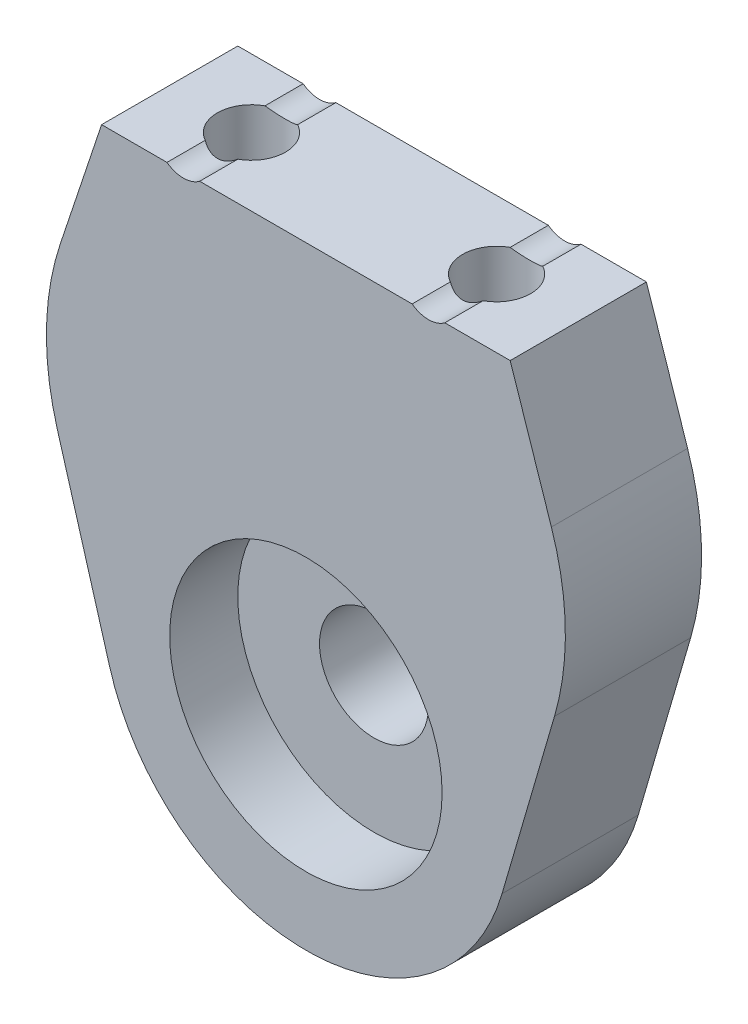
ISO-10303-21;
HEADER;
FILE_DESCRIPTION(('STEP AP214'),'2;1');
FILE_NAME('part.step','',(''),(''),'','','');
FILE_SCHEMA(('AUTOMOTIVE_DESIGN { 1 0 10303 214 1 1 1 1 }'));
ENDSEC;
DATA;
#1=APPLICATION_CONTEXT('core data for automotive mechanical design processes');
#2=APPLICATION_PROTOCOL_DEFINITION('international standard','automotive_design',2000,#1);
#3=PRODUCT_CONTEXT('',#1,'mechanical');
#4=PRODUCT('Part','Part','',(#3));
#5=PRODUCT_RELATED_PRODUCT_CATEGORY('part','',(#4));
#6=PRODUCT_DEFINITION_FORMATION('','',#4);
#7=PRODUCT_DEFINITION_CONTEXT('part definition',#1,'design');
#8=PRODUCT_DEFINITION('design','',#6,#7);
#9=PRODUCT_DEFINITION_SHAPE('','',#8);
#10=(LENGTH_UNIT() NAMED_UNIT(*) SI_UNIT(.MILLI.,.METRE.));
#11=(NAMED_UNIT(*) PLANE_ANGLE_UNIT() SI_UNIT($,.RADIAN.));
#12=(NAMED_UNIT(*) SI_UNIT($,.STERADIAN.) SOLID_ANGLE_UNIT());
#13=UNCERTAINTY_MEASURE_WITH_UNIT(LENGTH_MEASURE(1.E-05),#10,'distance_accuracy_value','');
#14=(GEOMETRIC_REPRESENTATION_CONTEXT(3) GLOBAL_UNCERTAINTY_ASSIGNED_CONTEXT((#13)) GLOBAL_UNIT_ASSIGNED_CONTEXT((#10,
#11,#12)) REPRESENTATION_CONTEXT('',''));
#15=CARTESIAN_POINT('',(0.,0.,0.));
#16=DIRECTION('',(0.,0.,1.));
#17=DIRECTION('',(1.,0.,0.));
#18=AXIS2_PLACEMENT_3D('',#15,#16,#17);
#19=CARTESIAN_POINT('',(-7.5,15.,-21.2132034355964));
#20=DIRECTION('',(0.,1.,0.));
#21=DIRECTION('',(0.,0.,1.));
#22=AXIS2_PLACEMENT_3D('',#19,#20,#21);
#23=PLANE('',#22);
#24=CARTESIAN_POINT('',(4.5,15.,2.5));
#25=DIRECTION('',(0.,1.,0.));
#26=DIRECTION('',(0.,0.,1.));
#27=AXIS2_PLACEMENT_3D('',#24,#25,#26);
#28=CIRCLE('',#27,1.24999999999999);
#29=CARTESIAN_POINT('',(5.1,15.,3.59658560997305));
#30=VERTEX_POINT('',#29);
#31=CARTESIAN_POINT('',(5.1,15.,1.40341439002695));
#32=VERTEX_POINT('',#31);
#33=EDGE_CURVE('E74',#30,#32,#28,.T.);
#34=ORIENTED_EDGE('',*,*,#33,.F.);
#35=DIRECTION('',(0.,0.,-1.));
#36=VECTOR('',#35,1.);
#37=CARTESIAN_POINT('',(5.1,15.,5.));
#38=LINE('',#37,#36);
#39=CARTESIAN_POINT('',(5.1,15.,5.));
#40=VERTEX_POINT('',#39);
#41=EDGE_CURVE('E286',#40,#30,#38,.T.);
#42=ORIENTED_EDGE('',*,*,#41,.F.);
#43=DIRECTION('',(-1.,0.,0.));
#44=VECTOR('',#43,1.);
#45=CARTESIAN_POINT('',(-7.5,15.,5.));
#46=LINE('',#45,#44);
#47=CARTESIAN_POINT('',(7.5,15.,5.));
#48=VERTEX_POINT('',#47);
#49=EDGE_CURVE('E315',#48,#40,#46,.T.);
#50=ORIENTED_EDGE('',*,*,#49,.F.);
#51=DIRECTION('',(0.,0.,1.));
#52=VECTOR('',#51,1.);
#53=CARTESIAN_POINT('',(7.5,15.,-21.2132034355964));
#54=LINE('',#53,#52);
#55=CARTESIAN_POINT('',(7.5,15.,0.));
#56=VERTEX_POINT('',#55);
#57=EDGE_CURVE('E318',#56,#48,#54,.T.);
#58=ORIENTED_EDGE('',*,*,#57,.F.);
#59=DIRECTION('',(1.,0.,0.));
#60=VECTOR('',#59,1.);
#61=CARTESIAN_POINT('',(-7.5,15.,0.));
#62=LINE('',#61,#60);
#63=CARTESIAN_POINT('',(5.1,15.,0.));
#64=VERTEX_POINT('',#63);
#65=EDGE_CURVE('E307',#64,#56,#62,.T.);
#66=ORIENTED_EDGE('',*,*,#65,.F.);
#67=EDGE_CURVE('E282',#32,#64,#38,.T.);
#68=ORIENTED_EDGE('',*,*,#67,.F.);
#69=EDGE_LOOP('',(#34,#42,#50,#58,#66,#68));
#70=FACE_BOUND('',#69,.T.);
#71=ADVANCED_FACE('F46',(#70),#23,.T.);
#72=CARTESIAN_POINT('',(-4.5,15.,2.5));
#73=DIRECTION('',(0.,1.,0.));
#74=DIRECTION('',(0.,0.,1.));
#75=AXIS2_PLACEMENT_3D('',#72,#73,#74);
#76=CIRCLE('',#75,1.24999999999999);
#77=CARTESIAN_POINT('',(-3.9,15.,3.59658560997305));
#78=VERTEX_POINT('',#77);
#79=CARTESIAN_POINT('',(-3.9,15.,1.40341439002695));
#80=VERTEX_POINT('',#79);
#81=EDGE_CURVE('E178',#78,#80,#76,.T.);
#82=ORIENTED_EDGE('',*,*,#81,.F.);
#83=DIRECTION('',(0.,0.,-1.));
#84=VECTOR('',#83,1.);
#85=CARTESIAN_POINT('',(-3.9,15.,5.));
#86=LINE('',#85,#84);
#87=CARTESIAN_POINT('',(-3.9,15.,5.));
#88=VERTEX_POINT('',#87);
#89=EDGE_CURVE('E276',#88,#78,#86,.T.);
#90=ORIENTED_EDGE('',*,*,#89,.F.);
#91=CARTESIAN_POINT('',(3.89999999999999,15.,5.));
#92=VERTEX_POINT('',#91);
#93=EDGE_CURVE('E319',#92,#88,#46,.T.);
#94=ORIENTED_EDGE('',*,*,#93,.F.);
#95=DIRECTION('',(0.,0.,-1.));
#96=VECTOR('',#95,1.);
#97=CARTESIAN_POINT('',(3.89999999999999,15.,5.));
#98=LINE('',#97,#96);
#99=CARTESIAN_POINT('',(3.89999999999999,15.,3.59658560997305));
#100=VERTEX_POINT('',#99);
#101=EDGE_CURVE('E291',#100,#92,#98,.F.);
#102=ORIENTED_EDGE('',*,*,#101,.F.);
#103=CARTESIAN_POINT('',(3.89999999999999,15.,1.40341439002695));
#104=VERTEX_POINT('',#103);
#105=EDGE_CURVE('E181',#104,#100,#28,.T.);
#106=ORIENTED_EDGE('',*,*,#105,.F.);
#107=CARTESIAN_POINT('',(3.89999999999999,15.,0.));
#108=VERTEX_POINT('',#107);
#109=EDGE_CURVE('E285',#108,#104,#98,.F.);
#110=ORIENTED_EDGE('',*,*,#109,.F.);
#111=CARTESIAN_POINT('',(-3.9,15.,0.));
#112=VERTEX_POINT('',#111);
#113=EDGE_CURVE('E304',#112,#108,#62,.T.);
#114=ORIENTED_EDGE('',*,*,#113,.F.);
#115=EDGE_CURVE('E275',#80,#112,#86,.T.);
#116=ORIENTED_EDGE('',*,*,#115,.F.);
#117=EDGE_LOOP('',(#82,#90,#94,#102,#106,#110,#114,#116));
#118=FACE_BOUND('',#117,.T.);
#119=ADVANCED_FACE('F239',(#118),#23,.T.);
#120=CARTESIAN_POINT('',(0.,0.,5.));
#121=DIRECTION('',(0.,0.,-1.));
#122=DIRECTION('',(-1.,0.,0.));
#123=AXIS2_PLACEMENT_3D('',#120,#121,#122);
#124=CYLINDRICAL_SURFACE('',#123,2.);
#125=CARTESIAN_POINT('',(0.,0.,0.));
#126=DIRECTION('',(0.,0.,1.));
#127=DIRECTION('',(1.,0.,0.));
#128=AXIS2_PLACEMENT_3D('',#125,#126,#127);
#129=CIRCLE('',#128,2.);
#130=CARTESIAN_POINT('',(2.,0.,0.));
#131=VERTEX_POINT('',#130);
#132=EDGE_CURVE('E309',#131,#131,#129,.T.);
#133=ORIENTED_EDGE('',*,*,#132,.F.);
#134=EDGE_LOOP('',(#133));
#135=FACE_BOUND('',#134,.T.);
#136=CARTESIAN_POINT('',(0.,0.,2.5));
#137=DIRECTION('',(0.,0.,1.));
#138=DIRECTION('',(1.,0.,0.));
#139=AXIS2_PLACEMENT_3D('',#136,#137,#138);
#140=CIRCLE('',#139,2.);
#141=CARTESIAN_POINT('',(2.,0.,2.5));
#142=VERTEX_POINT('',#141);
#143=EDGE_CURVE('E350',#142,#142,#140,.T.);
#144=ORIENTED_EDGE('',*,*,#143,.T.);
#145=EDGE_LOOP('',(#144));
#146=FACE_BOUND('',#145,.T.);
#147=ADVANCED_FACE('F246',(#135,#146),#124,.F.);
#148=CARTESIAN_POINT('',(0.,0.,5.));
#149=DIRECTION('',(0.,0.,-1.));
#150=DIRECTION('',(-1.,0.,0.));
#151=AXIS2_PLACEMENT_3D('',#148,#149,#150);
#152=CYLINDRICAL_SURFACE('',#151,7.5);
#153=DIRECTION('',(0.,0.,1.));
#154=VECTOR('',#153,1.);
#155=CARTESIAN_POINT('',(7.2,-2.1,-17.3277234511635));
#156=LINE('',#155,#154);
#157=CARTESIAN_POINT('',(7.2,-2.1,0.));
#158=VERTEX_POINT('',#157);
#159=CARTESIAN_POINT('',(7.2,-2.1,5.));
#160=VERTEX_POINT('',#159);
#161=EDGE_CURVE('E368',#158,#160,#156,.T.);
#162=ORIENTED_EDGE('',*,*,#161,.T.);
#163=CARTESIAN_POINT('',(0.,0.,5.));
#164=DIRECTION('',(0.,0.,1.));
#165=DIRECTION('',(1.,0.,0.));
#166=AXIS2_PLACEMENT_3D('',#163,#164,#165);
#167=CIRCLE('',#166,7.5);
#168=CARTESIAN_POINT('',(-7.2,-2.1,5.));
#169=VERTEX_POINT('',#168);
#170=EDGE_CURVE('E328',#169,#160,#167,.T.);
#171=ORIENTED_EDGE('',*,*,#170,.F.);
#172=DIRECTION('',(0.,0.,1.));
#173=VECTOR('',#172,1.);
#174=CARTESIAN_POINT('',(-7.2,-2.1,-17.3277234511635));
#175=LINE('',#174,#173);
#176=CARTESIAN_POINT('',(-7.2,-2.1,0.));
#177=VERTEX_POINT('',#176);
#178=EDGE_CURVE('E313',#177,#169,#175,.T.);
#179=ORIENTED_EDGE('',*,*,#178,.F.);
#180=CARTESIAN_POINT('',(0.,0.,0.));
#181=DIRECTION('',(0.,0.,1.));
#182=DIRECTION('',(1.,0.,0.));
#183=AXIS2_PLACEMENT_3D('',#180,#181,#182);
#184=CIRCLE('',#183,7.5);
#185=EDGE_CURVE('E327',#177,#158,#184,.T.);
#186=ORIENTED_EDGE('',*,*,#185,.T.);
#187=EDGE_LOOP('',(#162,#171,#179,#186));
#188=FACE_BOUND('',#187,.T.);
#189=ADVANCED_FACE('F392',(#188),#152,.T.);
#190=CARTESIAN_POINT('',(0.,0.,5.));
#191=DIRECTION('',(0.,0.,1.));
#192=DIRECTION('',(1.,0.,0.));
#193=AXIS2_PLACEMENT_3D('',#190,#191,#192);
#194=PLANE('',#193);
#195=CARTESIAN_POINT('',(4.5,15.8,5.));
#196=DIRECTION('',(0.,0.,-1.));
#197=DIRECTION('',(-1.,0.,0.));
#198=AXIS2_PLACEMENT_3D('',#195,#196,#197);
#199=CIRCLE('',#198,1.);
#200=EDGE_CURVE('E221',#40,#92,#199,.T.);
#201=ORIENTED_EDGE('',*,*,#200,.T.);
#202=ORIENTED_EDGE('',*,*,#93,.T.);
#203=CARTESIAN_POINT('',(-4.5,15.8,5.));
#204=DIRECTION('',(0.,0.,-1.));
#205=DIRECTION('',(1.,0.,0.));
#206=AXIS2_PLACEMENT_3D('',#203,#204,#205);
#207=CIRCLE('',#206,1.);
#208=CARTESIAN_POINT('',(-5.10000000000001,15.,5.));
#209=VERTEX_POINT('',#208);
#210=EDGE_CURVE('E219',#88,#209,#207,.T.);
#211=ORIENTED_EDGE('',*,*,#210,.T.);
#212=CARTESIAN_POINT('',(-7.5,15.,5.));
#213=VERTEX_POINT('',#212);
#214=EDGE_CURVE('E320',#209,#213,#46,.T.);
#215=ORIENTED_EDGE('',*,*,#214,.T.);
#216=DIRECTION('',(-0.316227766016838,-0.948683298050514,0.));
#217=VECTOR('',#216,1.);
#218=CARTESIAN_POINT('',(-7.5,15.,5.));
#219=LINE('',#218,#217);
#220=CARTESIAN_POINT('',(-9.01217884246544,10.4634634726037,5.));
#221=VERTEX_POINT('',#220);
#222=EDGE_CURVE('E381',#213,#221,#219,.T.);
#223=ORIENTED_EDGE('',*,*,#222,.T.);
#224=CARTESIAN_POINT('',(0.474654138039701,7.30118581243531,5.));
#225=DIRECTION('',(0.,0.,1.));
#226=DIRECTION('',(1.,0.,0.));
#227=AXIS2_PLACEMENT_3D('',#224,#225,#226);
#228=CIRCLE('',#227,10.);
#229=CARTESIAN_POINT('',(-9.1253458619603,4.50118581243531,5.));
#230=VERTEX_POINT('',#229);
#231=EDGE_CURVE('E336',#221,#230,#228,.T.);
#232=ORIENTED_EDGE('',*,*,#231,.T.);
#233=DIRECTION('',(0.28,-0.96,0.));
#234=VECTOR('',#233,1.);
#235=CARTESIAN_POINT('',(-10.,7.5,5.));
#236=LINE('',#235,#234);
#237=EDGE_CURVE('E370',#230,#169,#236,.T.);
#238=ORIENTED_EDGE('',*,*,#237,.T.);
#239=ORIENTED_EDGE('',*,*,#170,.T.);
#240=DIRECTION('',(0.28,0.96,0.));
#241=VECTOR('',#240,1.);
#242=CARTESIAN_POINT('',(10.,7.5,5.));
#243=LINE('',#242,#241);
#244=CARTESIAN_POINT('',(9.1253458619603,4.50118581243531,5.));
#245=VERTEX_POINT('',#244);
#246=EDGE_CURVE('E356',#160,#245,#243,.T.);
#247=ORIENTED_EDGE('',*,*,#246,.T.);
#248=CARTESIAN_POINT('',(-0.4746541380397,7.30118581243531,5.));
#249=DIRECTION('',(0.,0.,1.));
#250=DIRECTION('',(1.,0.,0.));
#251=AXIS2_PLACEMENT_3D('',#248,#249,#250);
#252=CIRCLE('',#251,10.);
#253=CARTESIAN_POINT('',(9.01217884246543,10.4634634726037,5.));
#254=VERTEX_POINT('',#253);
#255=EDGE_CURVE('E338',#245,#254,#252,.T.);
#256=ORIENTED_EDGE('',*,*,#255,.T.);
#257=DIRECTION('',(-0.316227766016838,0.948683298050514,0.));
#258=VECTOR('',#257,1.);
#259=CARTESIAN_POINT('',(7.5,15.,5.));
#260=LINE('',#259,#258);
#261=EDGE_CURVE('E352',#254,#48,#260,.T.);
#262=ORIENTED_EDGE('',*,*,#261,.T.);
#263=ORIENTED_EDGE('',*,*,#49,.T.);
#264=EDGE_LOOP('',(#201,#202,#211,#215,#223,#232,#238,#239,#247,#256,#262,#263));
#265=FACE_BOUND('',#264,.T.);
#266=CARTESIAN_POINT('',(0.,0.,5.));
#267=DIRECTION('',(0.,0.,1.));
#268=DIRECTION('',(1.,0.,0.));
#269=AXIS2_PLACEMENT_3D('',#266,#267,#268);
#270=CIRCLE('',#269,5.);
#271=CARTESIAN_POINT('',(5.,0.,5.));
#272=VERTEX_POINT('',#271);
#273=EDGE_CURVE('E278',#272,#272,#270,.T.);
#274=ORIENTED_EDGE('',*,*,#273,.F.);
#275=EDGE_LOOP('',(#274));
#276=FACE_BOUND('',#275,.T.);
#277=ADVANCED_FACE('F260',(#265,#276),#194,.T.);
#278=CARTESIAN_POINT('',(0.,0.,0.));
#279=DIRECTION('',(0.,0.,1.));
#280=DIRECTION('',(1.,0.,0.));
#281=AXIS2_PLACEMENT_3D('',#278,#279,#280);
#282=PLANE('',#281);
#283=ORIENTED_EDGE('',*,*,#113,.T.);
#284=CARTESIAN_POINT('',(4.5,15.8,0.));
#285=DIRECTION('',(0.,0.,-1.));
#286=DIRECTION('',(-1.,0.,0.));
#287=AXIS2_PLACEMENT_3D('',#284,#285,#286);
#288=CIRCLE('',#287,1.);
#289=EDGE_CURVE('E295',#64,#108,#288,.T.);
#290=ORIENTED_EDGE('',*,*,#289,.F.);
#291=ORIENTED_EDGE('',*,*,#65,.T.);
#292=DIRECTION('',(0.316227766016838,-0.948683298050514,0.));
#293=VECTOR('',#292,1.);
#294=CARTESIAN_POINT('',(7.5,15.,0.));
#295=LINE('',#294,#293);
#296=CARTESIAN_POINT('',(9.01217884246544,10.4634634726037,0.));
#297=VERTEX_POINT('',#296);
#298=EDGE_CURVE('E367',#56,#297,#295,.T.);
#299=ORIENTED_EDGE('',*,*,#298,.T.);
#300=CARTESIAN_POINT('',(-0.4746541380397,7.30118581243531,0.));
#301=DIRECTION('',(0.,0.,1.));
#302=DIRECTION('',(1.,0.,0.));
#303=AXIS2_PLACEMENT_3D('',#300,#301,#302);
#304=CIRCLE('',#303,10.);
#305=CARTESIAN_POINT('',(9.1253458619603,4.50118581243531,0.));
#306=VERTEX_POINT('',#305);
#307=EDGE_CURVE('E344',#297,#306,#304,.F.);
#308=ORIENTED_EDGE('',*,*,#307,.T.);
#309=DIRECTION('',(-0.28,-0.96,0.));
#310=VECTOR('',#309,1.);
#311=CARTESIAN_POINT('',(10.,7.5,0.));
#312=LINE('',#311,#310);
#313=EDGE_CURVE('E365',#306,#158,#312,.T.);
#314=ORIENTED_EDGE('',*,*,#313,.T.);
#315=ORIENTED_EDGE('',*,*,#185,.F.);
#316=DIRECTION('',(-0.28,0.96,0.));
#317=VECTOR('',#316,1.);
#318=CARTESIAN_POINT('',(-10.,7.5,0.));
#319=LINE('',#318,#317);
#320=CARTESIAN_POINT('',(-9.1253458619603,4.50118581243531,0.));
#321=VERTEX_POINT('',#320);
#322=EDGE_CURVE('E378',#177,#321,#319,.T.);
#323=ORIENTED_EDGE('',*,*,#322,.T.);
#324=CARTESIAN_POINT('',(0.474654138039701,7.30118581243531,0.));
#325=DIRECTION('',(0.,0.,1.));
#326=DIRECTION('',(1.,0.,0.));
#327=AXIS2_PLACEMENT_3D('',#324,#325,#326);
#328=CIRCLE('',#327,10.);
#329=CARTESIAN_POINT('',(-9.01217884246544,10.4634634726037,0.));
#330=VERTEX_POINT('',#329);
#331=EDGE_CURVE('E342',#321,#330,#328,.F.);
#332=ORIENTED_EDGE('',*,*,#331,.T.);
#333=DIRECTION('',(0.316227766016838,0.948683298050514,0.));
#334=VECTOR('',#333,1.);
#335=CARTESIAN_POINT('',(-7.5,15.,0.));
#336=LINE('',#335,#334);
#337=CARTESIAN_POINT('',(-7.5,15.,0.));
#338=VERTEX_POINT('',#337);
#339=EDGE_CURVE('E376',#330,#338,#336,.T.);
#340=ORIENTED_EDGE('',*,*,#339,.T.);
#341=CARTESIAN_POINT('',(-5.10000000000001,15.,0.));
#342=VERTEX_POINT('',#341);
#343=EDGE_CURVE('E306',#338,#342,#62,.T.);
#344=ORIENTED_EDGE('',*,*,#343,.T.);
#345=CARTESIAN_POINT('',(-4.5,15.8,0.));
#346=DIRECTION('',(0.,0.,-1.));
#347=DIRECTION('',(1.,0.,0.));
#348=AXIS2_PLACEMENT_3D('',#345,#346,#347);
#349=CIRCLE('',#348,1.);
#350=EDGE_CURVE('E274',#112,#342,#349,.T.);
#351=ORIENTED_EDGE('',*,*,#350,.F.);
#352=EDGE_LOOP('',(#283,#290,#291,#299,#308,#314,#315,#323,#332,#340,#344,#351));
#353=FACE_BOUND('',#352,.T.);
#354=ORIENTED_EDGE('',*,*,#132,.T.);
#355=EDGE_LOOP('',(#354));
#356=FACE_BOUND('',#355,.T.);
#357=ADVANCED_FACE('F252',(#353,#356),#282,.F.);
#358=CARTESIAN_POINT('',(-5.10000000000001,15.,1.40341439002695));
#359=VERTEX_POINT('',#358);
#360=CARTESIAN_POINT('',(-5.10000000000001,15.,3.59658560997305));
#361=VERTEX_POINT('',#360);
#362=EDGE_CURVE('E67',#359,#361,#76,.T.);
#363=ORIENTED_EDGE('',*,*,#362,.F.);
#364=DIRECTION('',(0.,0.,-1.));
#365=VECTOR('',#364,1.);
#366=CARTESIAN_POINT('',(-5.10000000000001,15.,5.));
#367=LINE('',#366,#365);
#368=EDGE_CURVE('E267',#342,#359,#367,.F.);
#369=ORIENTED_EDGE('',*,*,#368,.F.);
#370=ORIENTED_EDGE('',*,*,#343,.F.);
#371=DIRECTION('',(0.,0.,1.));
#372=VECTOR('',#371,1.);
#373=CARTESIAN_POINT('',(-7.5,15.,-21.2132034355964));
#374=LINE('',#373,#372);
#375=EDGE_CURVE('E310',#338,#213,#374,.T.);
#376=ORIENTED_EDGE('',*,*,#375,.T.);
#377=ORIENTED_EDGE('',*,*,#214,.F.);
#378=EDGE_CURVE('E270',#361,#209,#367,.F.);
#379=ORIENTED_EDGE('',*,*,#378,.F.);
#380=EDGE_LOOP('',(#363,#369,#370,#376,#377,#379));
#381=FACE_BOUND('',#380,.T.);
#382=ADVANCED_FACE('F242',(#381),#23,.T.);
#383=CARTESIAN_POINT('',(-10.,7.5,-17.3277234511635));
#384=DIRECTION('',(-0.96,-0.28,0.));
#385=DIRECTION('',(0.28,-0.96,0.));
#386=AXIS2_PLACEMENT_3D('',#383,#384,#385);
#387=PLANE('',#386);
#388=ORIENTED_EDGE('',*,*,#237,.F.);
#389=DIRECTION('',(0.,0.,1.));
#390=VECTOR('',#389,1.);
#391=CARTESIAN_POINT('',(-9.1253458619603,4.50118581243531,-17.3277234511635));
#392=LINE('',#391,#390);
#393=EDGE_CURVE('E349',#230,#321,#392,.F.);
#394=ORIENTED_EDGE('',*,*,#393,.T.);
#395=ORIENTED_EDGE('',*,*,#322,.F.);
#396=ORIENTED_EDGE('',*,*,#178,.T.);
#397=EDGE_LOOP('',(#388,#394,#395,#396));
#398=FACE_BOUND('',#397,.T.);
#399=ADVANCED_FACE('F251',(#398),#387,.T.);
#400=CARTESIAN_POINT('',(-7.5,15.,-17.3277234511635));
#401=DIRECTION('',(-0.948683298050514,0.316227766016838,0.));
#402=DIRECTION('',(-0.316227766016838,-0.948683298050514,0.));
#403=AXIS2_PLACEMENT_3D('',#400,#401,#402);
#404=PLANE('',#403);
#405=ORIENTED_EDGE('',*,*,#339,.F.);
#406=DIRECTION('',(0.,0.,1.));
#407=VECTOR('',#406,1.);
#408=CARTESIAN_POINT('',(-9.01217884246544,10.4634634726037,-17.3277234511635));
#409=LINE('',#408,#407);
#410=EDGE_CURVE('E346',#330,#221,#409,.T.);
#411=ORIENTED_EDGE('',*,*,#410,.T.);
#412=ORIENTED_EDGE('',*,*,#222,.F.);
#413=ORIENTED_EDGE('',*,*,#375,.F.);
#414=EDGE_LOOP('',(#405,#411,#412,#413));
#415=FACE_BOUND('',#414,.T.);
#416=ADVANCED_FACE('F258',(#415),#404,.T.);
#417=CARTESIAN_POINT('',(7.5,15.,-17.3277234511635));
#418=DIRECTION('',(0.948683298050514,0.316227766016838,0.));
#419=DIRECTION('',(-0.316227766016838,0.948683298050514,0.));
#420=AXIS2_PLACEMENT_3D('',#417,#418,#419);
#421=PLANE('',#420);
#422=ORIENTED_EDGE('',*,*,#261,.F.);
#423=DIRECTION('',(0.,0.,1.));
#424=VECTOR('',#423,1.);
#425=CARTESIAN_POINT('',(9.01217884246544,10.4634634726037,-17.3277234511635));
#426=LINE('',#425,#424);
#427=EDGE_CURVE('E340',#254,#297,#426,.F.);
#428=ORIENTED_EDGE('',*,*,#427,.T.);
#429=ORIENTED_EDGE('',*,*,#298,.F.);
#430=ORIENTED_EDGE('',*,*,#57,.T.);
#431=EDGE_LOOP('',(#422,#428,#429,#430));
#432=FACE_BOUND('',#431,.T.);
#433=ADVANCED_FACE('F411',(#432),#421,.T.);
#434=CARTESIAN_POINT('',(10.,7.5,-17.3277234511635));
#435=DIRECTION('',(0.96,-0.28,0.));
#436=DIRECTION('',(0.28,0.96,0.));
#437=AXIS2_PLACEMENT_3D('',#434,#435,#436);
#438=PLANE('',#437);
#439=ORIENTED_EDGE('',*,*,#313,.F.);
#440=DIRECTION('',(0.,0.,1.));
#441=VECTOR('',#440,1.);
#442=CARTESIAN_POINT('',(9.1253458619603,4.50118581243531,-17.3277234511635));
#443=LINE('',#442,#441);
#444=EDGE_CURVE('E331',#306,#245,#443,.T.);
#445=ORIENTED_EDGE('',*,*,#444,.T.);
#446=ORIENTED_EDGE('',*,*,#246,.F.);
#447=ORIENTED_EDGE('',*,*,#161,.F.);
#448=EDGE_LOOP('',(#439,#445,#446,#447));
#449=FACE_BOUND('',#448,.T.);
#450=ADVANCED_FACE('F405',(#449),#438,.T.);
#451=CARTESIAN_POINT('',(-0.4746541380397,7.30118581243531,-17.3277234511635));
#452=DIRECTION('',(0.,0.,1.));
#453=DIRECTION('',(1.,0.,0.));
#454=AXIS2_PLACEMENT_3D('',#451,#452,#453);
#455=CYLINDRICAL_SURFACE('',#454,10.);
#456=ORIENTED_EDGE('',*,*,#307,.F.);
#457=ORIENTED_EDGE('',*,*,#427,.F.);
#458=ORIENTED_EDGE('',*,*,#255,.F.);
#459=ORIENTED_EDGE('',*,*,#444,.F.);
#460=EDGE_LOOP('',(#456,#457,#458,#459));
#461=FACE_BOUND('',#460,.T.);
#462=ADVANCED_FACE('F407',(#461),#455,.T.);
#463=CARTESIAN_POINT('',(0.474654138039701,7.30118581243531,-17.3277234511635));
#464=DIRECTION('',(0.,0.,1.));
#465=DIRECTION('',(1.,0.,0.));
#466=AXIS2_PLACEMENT_3D('',#463,#464,#465);
#467=CYLINDRICAL_SURFACE('',#466,10.);
#468=ORIENTED_EDGE('',*,*,#331,.F.);
#469=ORIENTED_EDGE('',*,*,#393,.F.);
#470=ORIENTED_EDGE('',*,*,#231,.F.);
#471=ORIENTED_EDGE('',*,*,#410,.F.);
#472=EDGE_LOOP('',(#468,#469,#470,#471));
#473=FACE_BOUND('',#472,.T.);
#474=ADVANCED_FACE('F48',(#473),#467,.T.);
#475=CARTESIAN_POINT('',(0.,0.,2.5));
#476=DIRECTION('',(0.,0.,1.));
#477=DIRECTION('',(1.,0.,0.));
#478=AXIS2_PLACEMENT_3D('',#475,#476,#477);
#479=CYLINDRICAL_SURFACE('',#478,5.);
#480=CARTESIAN_POINT('',(0.,0.,2.5));
#481=DIRECTION('',(0.,0.,1.));
#482=DIRECTION('',(1.,0.,0.));
#483=AXIS2_PLACEMENT_3D('',#480,#481,#482);
#484=CIRCLE('',#483,5.);
#485=CARTESIAN_POINT('',(5.,0.,2.5));
#486=VERTEX_POINT('',#485);
#487=EDGE_CURVE('E353',#486,#486,#484,.T.);
#488=ORIENTED_EDGE('',*,*,#487,.F.);
#489=EDGE_LOOP('',(#488));
#490=FACE_BOUND('',#489,.T.);
#491=ORIENTED_EDGE('',*,*,#273,.T.);
#492=EDGE_LOOP('',(#491));
#493=FACE_BOUND('',#492,.T.);
#494=ADVANCED_FACE('F235',(#490,#493),#479,.F.);
#495=CARTESIAN_POINT('',(0.,0.,2.5));
#496=DIRECTION('',(0.,0.,1.));
#497=DIRECTION('',(1.,0.,0.));
#498=AXIS2_PLACEMENT_3D('',#495,#496,#497);
#499=PLANE('',#498);
#500=ORIENTED_EDGE('',*,*,#143,.F.);
#501=EDGE_LOOP('',(#500));
#502=FACE_BOUND('',#501,.T.);
#503=ORIENTED_EDGE('',*,*,#487,.T.);
#504=EDGE_LOOP('',(#503));
#505=FACE_BOUND('',#504,.T.);
#506=ADVANCED_FACE('F227',(#502,#505),#499,.T.);
#507=CARTESIAN_POINT('',(4.5,15.8,5.));
#508=DIRECTION('',(0.,0.,-1.));
#509=DIRECTION('',(-1.,0.,0.));
#510=AXIS2_PLACEMENT_3D('',#507,#508,#509);
#511=CYLINDRICAL_SURFACE('',#510,1.);
#512=ORIENTED_EDGE('',*,*,#41,.T.);
#513=CARTESIAN_POINT('',(5.1,15.,3.59658560997305));
#514=CARTESIAN_POINT('',(5.0621606110136,14.9715939387001,3.61733312031784));
#515=CARTESIAN_POINT('',(5.02172521739274,14.9454955238183,3.63686567463709));
#516=CARTESIAN_POINT('',(4.93599902593592,14.8987242285809,3.67241214424978));
#517=CARTESIAN_POINT('',(4.8906746471093,14.8780927424333,3.68839907249321));
#518=CARTESIAN_POINT('',(4.7958067976335,14.8434123101396,3.71550261304154));
#519=CARTESIAN_POINT('',(4.74624017320997,14.8294026208368,3.72659015507413));
#520=CARTESIAN_POINT('',(4.64473934601039,14.8091858719137,3.74264760506819));
#521=CARTESIAN_POINT('',(4.59281473704862,14.8029496978447,3.7476403386894));
#522=CARTESIAN_POINT('',(4.49439021167574,14.7989437450897,3.75084510322957));
#523=CARTESIAN_POINT('',(4.44794699595056,14.8002895095487,3.7497655154879));
#524=CARTESIAN_POINT('',(4.35605719949201,14.809337247898,3.74253977168698));
#525=CARTESIAN_POINT('',(4.31061139722522,14.8170440171798,3.7363897931997));
#526=CARTESIAN_POINT('',(4.22375050410616,14.8379151219033,3.71986423457122));
#527=CARTESIAN_POINT('',(4.18224751488552,14.8508570176514,3.70966115486539));
#528=CARTESIAN_POINT('',(4.10214164765266,14.8815506473168,3.6857304894337));
#529=CARTESIAN_POINT('',(4.06353963598471,14.8993038108315,3.67200185620518));
#530=CARTESIAN_POINT('',(4.00421842738448,14.9311786217879,3.64773238285719));
#531=CARTESIAN_POINT('',(3.9824209314735,14.943995780743,3.63805153975628));
#532=CARTESIAN_POINT('',(3.94019696215797,14.9709974498632,3.6178845862529));
#533=CARTESIAN_POINT('',(3.91976620945191,14.985177317297,3.60740123320559));
#534=CARTESIAN_POINT('',(3.89999999999999,15.,3.59658560997305));
#535=B_SPLINE_CURVE_WITH_KNOTS('',3,(#513,#514,#515,#516,#517,#518,#519,#520,#521,#522,#523,
#524,#525,#526,#527,#528,#529,#530,#531,#532,#533,#534),.UNSPECIFIED.,.F.,.F.,(4,2,2,2,2,2,2,2,
2,2,4),(0.,0.15508840486581,0.311319555923142,0.468465641907842,0.62502137667001,
0.763722354664079,0.902527991222132,1.03596896841179,1.16944963917844,1.2506056188113,
1.33149429275095),.UNSPECIFIED.);
#536=EDGE_CURVE('E212',#30,#100,#535,.T.);
#537=ORIENTED_EDGE('',*,*,#536,.T.);
#538=ORIENTED_EDGE('',*,*,#101,.T.);
#539=ORIENTED_EDGE('',*,*,#200,.F.);
#540=EDGE_LOOP('',(#512,#537,#538,#539));
#541=FACE_BOUND('',#540,.T.);
#542=ADVANCED_FACE('F223',(#541),#511,.F.);
#543=ORIENTED_EDGE('',*,*,#109,.T.);
#544=CARTESIAN_POINT('',(3.89999999999999,15.,1.40341439002695));
#545=CARTESIAN_POINT('',(3.93783938898639,14.9715939387001,1.38266687968216));
#546=CARTESIAN_POINT('',(3.97827478260725,14.9454955238183,1.36313432536291));
#547=CARTESIAN_POINT('',(4.06400097406407,14.8987242285809,1.32758785575022));
#548=CARTESIAN_POINT('',(4.10932535289069,14.8780927424333,1.31160092750679));
#549=CARTESIAN_POINT('',(4.2041932023665,14.8434123101396,1.28449738695846));
#550=CARTESIAN_POINT('',(4.25375982679003,14.8294026208368,1.27340984492587));
#551=CARTESIAN_POINT('',(4.35526065398961,14.8091858719137,1.25735239493181));
#552=CARTESIAN_POINT('',(4.40718526295137,14.8029496978447,1.2523596613106));
#553=CARTESIAN_POINT('',(4.50560978832425,14.7989437450897,1.24915489677043));
#554=CARTESIAN_POINT('',(4.55205300404944,14.8002895095487,1.2502344845121));
#555=CARTESIAN_POINT('',(4.64394280050798,14.809337247898,1.25746022831302));
#556=CARTESIAN_POINT('',(4.68938860277478,14.8170440171798,1.2636102068003));
#557=CARTESIAN_POINT('',(4.77624949589383,14.8379151219033,1.28013576542878));
#558=CARTESIAN_POINT('',(4.81775248511447,14.8508570176514,1.29033884513461));
#559=CARTESIAN_POINT('',(4.89785835234733,14.8815506473168,1.3142695105663));
#560=CARTESIAN_POINT('',(4.93646036401528,14.8993038108315,1.32799814379482));
#561=CARTESIAN_POINT('',(4.99578157261552,14.9311786217879,1.35226761714281));
#562=CARTESIAN_POINT('',(5.01757906852649,14.943995780743,1.36194846024373));
#563=CARTESIAN_POINT('',(5.05980303784202,14.9709974498632,1.3821154137471));
#564=CARTESIAN_POINT('',(5.08023379054808,14.985177317297,1.39259876679441));
#565=CARTESIAN_POINT('',(5.1,15.,1.40341439002695));
#566=B_SPLINE_CURVE_WITH_KNOTS('',3,(#544,#545,#546,#547,#548,#549,#550,#551,#552,#553,#554,
#555,#556,#557,#558,#559,#560,#561,#562,#563,#564,#565),.UNSPECIFIED.,.F.,.F.,(4,2,2,2,2,2,2,2,
2,2,4),(0.,0.155088404865809,0.311319555923142,0.468465641907843,0.625021376670011,
0.76372235466408,0.902527991222134,1.0359689684118,1.16944963917844,1.2506056188113,
1.33149429275095),.UNSPECIFIED.);
#567=EDGE_CURVE('E60',#104,#32,#566,.T.);
#568=ORIENTED_EDGE('',*,*,#567,.T.);
#569=ORIENTED_EDGE('',*,*,#67,.T.);
#570=ORIENTED_EDGE('',*,*,#289,.T.);
#571=EDGE_LOOP('',(#543,#568,#569,#570));
#572=FACE_BOUND('',#571,.T.);
#573=ADVANCED_FACE('F226',(#572),#511,.F.);
#574=CARTESIAN_POINT('',(-4.5,15.8,5.));
#575=DIRECTION('',(0.,0.,-1.));
#576=DIRECTION('',(-1.,0.,0.));
#577=AXIS2_PLACEMENT_3D('',#574,#575,#576);
#578=CYLINDRICAL_SURFACE('',#577,1.);
#579=ORIENTED_EDGE('',*,*,#89,.T.);
#580=CARTESIAN_POINT('',(-3.9,15.,3.59658560997305));
#581=CARTESIAN_POINT('',(-3.9378393889864,14.9715939387001,3.61733312031784));
#582=CARTESIAN_POINT('',(-3.97827478260726,14.9454955238183,3.6368656746371));
#583=CARTESIAN_POINT('',(-4.06400097406408,14.8987242285809,3.67241214424979));
#584=CARTESIAN_POINT('',(-4.10932535289069,14.8780927424333,3.68839907249321));
#585=CARTESIAN_POINT('',(-4.2041932023665,14.8434123101396,3.71550261304154));
#586=CARTESIAN_POINT('',(-4.25375982679003,14.8294026208368,3.72659015507413));
#587=CARTESIAN_POINT('',(-4.35526065398961,14.8091858719137,3.74264760506819));
#588=CARTESIAN_POINT('',(-4.40718526295138,14.8029496978447,3.7476403386894));
#589=CARTESIAN_POINT('',(-4.50560978832426,14.7989437450897,3.75084510322957));
#590=CARTESIAN_POINT('',(-4.55205300404944,14.8002895095487,3.7497655154879));
#591=CARTESIAN_POINT('',(-4.64394280050799,14.809337247898,3.74253977168698));
#592=CARTESIAN_POINT('',(-4.68938860277478,14.8170440171798,3.7363897931997));
#593=CARTESIAN_POINT('',(-4.77624949589384,14.8379151219033,3.71986423457122));
#594=CARTESIAN_POINT('',(-4.81775248511448,14.8508570176514,3.70966115486539));
#595=CARTESIAN_POINT('',(-4.89785835234734,14.8815506473168,3.6857304894337));
#596=CARTESIAN_POINT('',(-4.93646036401529,14.8993038108315,3.67200185620518));
#597=CARTESIAN_POINT('',(-4.99578157261552,14.9311786217879,3.64773238285719));
#598=CARTESIAN_POINT('',(-5.0175790685265,14.943995780743,3.63805153975627));
#599=CARTESIAN_POINT('',(-5.05980303784203,14.9709974498632,3.61788458625289));
#600=CARTESIAN_POINT('',(-5.08023379054809,14.985177317297,3.60740123320559));
#601=CARTESIAN_POINT('',(-5.10000000000001,15.,3.59658560997305));
#602=B_SPLINE_CURVE_WITH_KNOTS('',3,(#580,#581,#582,#583,#584,#585,#586,#587,#588,#589,#590,
#591,#592,#593,#594,#595,#596,#597,#598,#599,#600,#601),.UNSPECIFIED.,.F.,.F.,(4,2,2,2,2,2,2,2,
2,2,4),(0.,0.15508840486581,0.311319555923142,0.468465641907842,0.625021376670011,
0.763722354664079,0.902527991222132,1.03596896841179,1.16944963917844,1.2506056188113,
1.33149429275095),.UNSPECIFIED.);
#603=EDGE_CURVE('E11',#78,#361,#602,.T.);
#604=ORIENTED_EDGE('',*,*,#603,.T.);
#605=ORIENTED_EDGE('',*,*,#378,.T.);
#606=ORIENTED_EDGE('',*,*,#210,.F.);
#607=EDGE_LOOP('',(#579,#604,#605,#606));
#608=FACE_BOUND('',#607,.T.);
#609=ADVANCED_FACE('F190',(#608),#578,.F.);
#610=ORIENTED_EDGE('',*,*,#368,.T.);
#611=CARTESIAN_POINT('',(-5.10000000000001,15.,1.40341439002695));
#612=CARTESIAN_POINT('',(-5.06216061101361,14.9715939387001,1.38266687968217));
#613=CARTESIAN_POINT('',(-5.02172521739274,14.9454955238183,1.36313432536291));
#614=CARTESIAN_POINT('',(-4.93599902593593,14.8987242285809,1.32758785575022));
#615=CARTESIAN_POINT('',(-4.89067464710931,14.8780927424333,1.31160092750679));
#616=CARTESIAN_POINT('',(-4.7958067976335,14.8434123101396,1.28449738695846));
#617=CARTESIAN_POINT('',(-4.74624017320997,14.8294026208368,1.27340984492587));
#618=CARTESIAN_POINT('',(-4.64473934601039,14.8091858719137,1.25735239493181));
#619=CARTESIAN_POINT('',(-4.59281473704863,14.8029496978447,1.2523596613106));
#620=CARTESIAN_POINT('',(-4.49439021167575,14.7989437450897,1.24915489677043));
#621=CARTESIAN_POINT('',(-4.44794699595056,14.8002895095487,1.2502344845121));
#622=CARTESIAN_POINT('',(-4.35605719949202,14.809337247898,1.25746022831302));
#623=CARTESIAN_POINT('',(-4.31061139722522,14.8170440171798,1.2636102068003));
#624=CARTESIAN_POINT('',(-4.22375050410617,14.8379151219033,1.28013576542878));
#625=CARTESIAN_POINT('',(-4.18224751488553,14.8508570176514,1.29033884513461));
#626=CARTESIAN_POINT('',(-4.10214164765266,14.8815506473168,1.3142695105663));
#627=CARTESIAN_POINT('',(-4.06353963598472,14.8993038108315,1.32799814379482));
#628=CARTESIAN_POINT('',(-4.00421842738448,14.9311786217879,1.35226761714281));
#629=CARTESIAN_POINT('',(-3.98242093147351,14.943995780743,1.36194846024372));
#630=CARTESIAN_POINT('',(-3.94019696215797,14.9709974498632,1.3821154137471));
#631=CARTESIAN_POINT('',(-3.91976620945192,14.985177317297,1.39259876679441));
#632=CARTESIAN_POINT('',(-3.9,15.,1.40341439002695));
#633=B_SPLINE_CURVE_WITH_KNOTS('',3,(#611,#612,#613,#614,#615,#616,#617,#618,#619,#620,#621,
#622,#623,#624,#625,#626,#627,#628,#629,#630,#631,#632),.UNSPECIFIED.,.F.,.F.,(4,2,2,2,2,2,2,2,
2,2,4),(0.,0.155088404865809,0.311319555923142,0.468465641907843,0.625021376670011,
0.763722354664081,0.902527991222134,1.0359689684118,1.16944963917844,1.2506056188113,
1.33149429275095),.UNSPECIFIED.);
#634=EDGE_CURVE('E177',#359,#80,#633,.T.);
#635=ORIENTED_EDGE('',*,*,#634,.T.);
#636=ORIENTED_EDGE('',*,*,#115,.T.);
#637=ORIENTED_EDGE('',*,*,#350,.T.);
#638=EDGE_LOOP('',(#610,#635,#636,#637));
#639=FACE_BOUND('',#638,.T.);
#640=ADVANCED_FACE('F203',(#639),#578,.F.);
#641=CARTESIAN_POINT('',(4.5,15.,2.5));
#642=DIRECTION('',(0.,1.,0.));
#643=DIRECTION('',(0.,0.,1.));
#644=AXIS2_PLACEMENT_3D('',#641,#642,#643);
#645=CYLINDRICAL_SURFACE('',#644,1.24999999999999);
#646=CARTESIAN_POINT('',(4.5,6.49999999999999,2.5));
#647=DIRECTION('',(0.,1.,0.));
#648=DIRECTION('',(0.,0.,1.));
#649=AXIS2_PLACEMENT_3D('',#646,#647,#648);
#650=CIRCLE('',#649,1.24999999999999);
#651=CARTESIAN_POINT('',(4.5,6.49999999999999,3.74999999999999));
#652=VERTEX_POINT('',#651);
#653=EDGE_CURVE('E220',#652,#652,#650,.T.);
#654=ORIENTED_EDGE('',*,*,#653,.F.);
#655=EDGE_LOOP('',(#654));
#656=FACE_BOUND('',#655,.T.);
#657=ORIENTED_EDGE('',*,*,#33,.T.);
#658=ORIENTED_EDGE('',*,*,#567,.F.);
#659=ORIENTED_EDGE('',*,*,#105,.T.);
#660=ORIENTED_EDGE('',*,*,#536,.F.);
#661=EDGE_LOOP('',(#657,#658,#659,#660));
#662=FACE_BOUND('',#661,.T.);
#663=ADVANCED_FACE('F199',(#656,#662),#645,.F.);
#664=CARTESIAN_POINT('',(4.5,6.49999999999999,2.5));
#665=DIRECTION('',(0.,1.,0.));
#666=DIRECTION('',(0.,0.,1.));
#667=AXIS2_PLACEMENT_3D('',#664,#665,#666);
#668=CONICAL_SURFACE('',#667,1.24999999999999,1.02974425867665);
#669=CARTESIAN_POINT('',(4.49999999999999,5.74892422621555,2.5));
#670=VERTEX_POINT('',#669);
#671=VERTEX_LOOP('',#670);
#672=FACE_BOUND('',#671,.T.);
#673=ORIENTED_EDGE('',*,*,#653,.T.);
#674=EDGE_LOOP('',(#673));
#675=FACE_BOUND('',#674,.T.);
#676=ADVANCED_FACE('F196',(#672,#675),#668,.F.);
#677=CARTESIAN_POINT('',(-4.5,15.,2.5));
#678=DIRECTION('',(0.,1.,0.));
#679=DIRECTION('',(0.,0.,1.));
#680=AXIS2_PLACEMENT_3D('',#677,#678,#679);
#681=CYLINDRICAL_SURFACE('',#680,1.24999999999999);
#682=CARTESIAN_POINT('',(-4.5,6.49999999999999,2.5));
#683=DIRECTION('',(0.,1.,0.));
#684=DIRECTION('',(0.,0.,1.));
#685=AXIS2_PLACEMENT_3D('',#682,#683,#684);
#686=CIRCLE('',#685,1.24999999999999);
#687=CARTESIAN_POINT('',(-4.5,6.49999999999999,3.74999999999999));
#688=VERTEX_POINT('',#687);
#689=EDGE_CURVE('E175',#688,#688,#686,.T.);
#690=ORIENTED_EDGE('',*,*,#689,.F.);
#691=EDGE_LOOP('',(#690));
#692=FACE_BOUND('',#691,.T.);
#693=ORIENTED_EDGE('',*,*,#362,.T.);
#694=ORIENTED_EDGE('',*,*,#603,.F.);
#695=ORIENTED_EDGE('',*,*,#81,.T.);
#696=ORIENTED_EDGE('',*,*,#634,.F.);
#697=EDGE_LOOP('',(#693,#694,#695,#696));
#698=FACE_BOUND('',#697,.T.);
#699=ADVANCED_FACE('F171',(#692,#698),#681,.F.);
#700=CARTESIAN_POINT('',(-4.5,6.49999999999999,2.5));
#701=DIRECTION('',(0.,1.,0.));
#702=DIRECTION('',(0.,0.,1.));
#703=AXIS2_PLACEMENT_3D('',#700,#701,#702);
#704=CONICAL_SURFACE('',#703,1.24999999999999,1.02974425867665);
#705=CARTESIAN_POINT('',(-4.5,5.74892422621555,2.5));
#706=VERTEX_POINT('',#705);
#707=VERTEX_LOOP('',#706);
#708=FACE_BOUND('',#707,.T.);
#709=ORIENTED_EDGE('',*,*,#689,.T.);
#710=EDGE_LOOP('',(#709));
#711=FACE_BOUND('',#710,.T.);
#712=ADVANCED_FACE('F168',(#708,#711),#704,.F.);
#713=CLOSED_SHELL('',(#71,#119,#147,#189,#277,#357,#382,#399,#416,#433,#450,#462,#474,#494,#506,
#542,#573,#609,#640,#663,#676,#699,#712));
#714=MANIFOLD_SOLID_BREP('B2',#713);
#715=ADVANCED_BREP_SHAPE_REPRESENTATION('',(#18,#714),#14);
#716=SHAPE_DEFINITION_REPRESENTATION(#9,#715);
ENDSEC;
END-ISO-10303-21;
